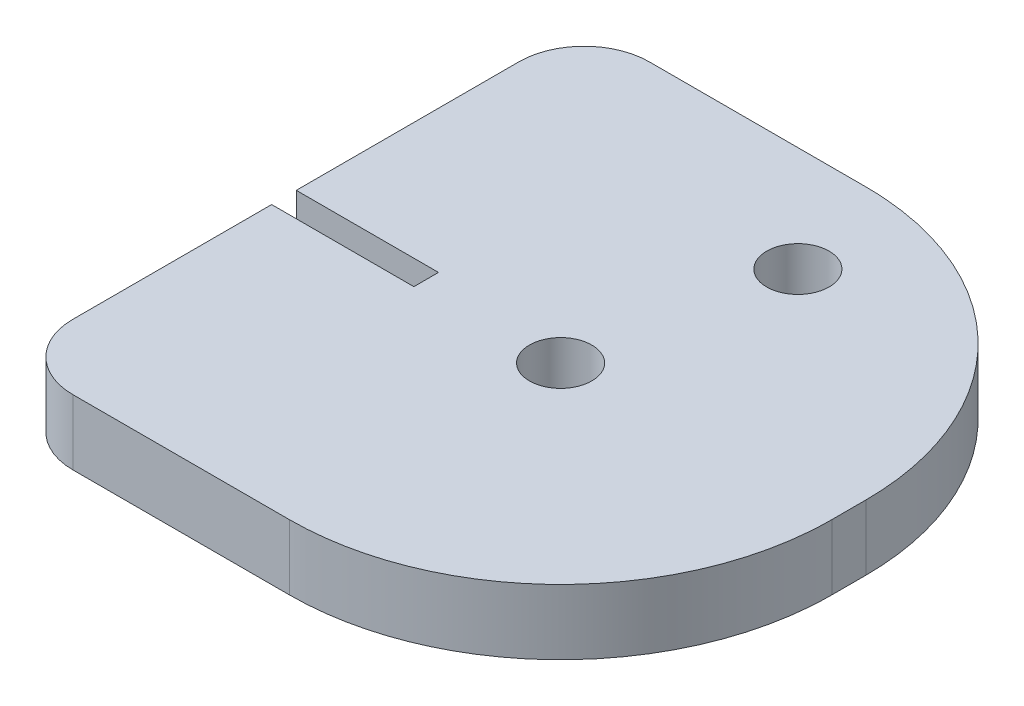
ISO-10303-21;
HEADER;
FILE_DESCRIPTION(('STEP AP214'),'2;1');
FILE_NAME('part.step','',(''),(''),'','','');
FILE_SCHEMA(('AUTOMOTIVE_DESIGN { 1 0 10303 214 1 1 1 1 }'));
ENDSEC;
DATA;
#1=APPLICATION_CONTEXT('core data for automotive mechanical design processes');
#2=APPLICATION_PROTOCOL_DEFINITION('international standard','automotive_design',2000,#1);
#3=PRODUCT_CONTEXT('',#1,'mechanical');
#4=PRODUCT('Part','Part','',(#3));
#5=PRODUCT_RELATED_PRODUCT_CATEGORY('part','',(#4));
#6=PRODUCT_DEFINITION_FORMATION('','',#4);
#7=PRODUCT_DEFINITION_CONTEXT('part definition',#1,'design');
#8=PRODUCT_DEFINITION('design','',#6,#7);
#9=PRODUCT_DEFINITION_SHAPE('','',#8);
#10=(LENGTH_UNIT() NAMED_UNIT(*) SI_UNIT(.MILLI.,.METRE.));
#11=(NAMED_UNIT(*) PLANE_ANGLE_UNIT() SI_UNIT($,.RADIAN.));
#12=(NAMED_UNIT(*) SI_UNIT($,.STERADIAN.) SOLID_ANGLE_UNIT());
#13=UNCERTAINTY_MEASURE_WITH_UNIT(LENGTH_MEASURE(1.E-05),#10,'distance_accuracy_value','');
#14=(GEOMETRIC_REPRESENTATION_CONTEXT(3) GLOBAL_UNCERTAINTY_ASSIGNED_CONTEXT((#13)) GLOBAL_UNIT_ASSIGNED_CONTEXT((#10,
#11,#12)) REPRESENTATION_CONTEXT('',''));
#15=CARTESIAN_POINT('',(0.,0.,0.));
#16=DIRECTION('',(0.,0.,1.));
#17=DIRECTION('',(1.,0.,0.));
#18=AXIS2_PLACEMENT_3D('',#15,#16,#17);
#19=CARTESIAN_POINT('',(6.13220271150249,0.,-14.0407050027723));
#20=DIRECTION('',(1.,0.,0.));
#21=DIRECTION('',(0.,0.,-1.));
#22=AXIS2_PLACEMENT_3D('',#19,#20,#21);
#23=PLANE('',#22);
#24=DIRECTION('',(0.,0.,-1.));
#25=VECTOR('',#24,1.);
#26=CARTESIAN_POINT('',(6.13220271150249,3.175,-14.0407050027723));
#27=LINE('',#26,#25);
#28=CARTESIAN_POINT('',(6.13220271150249,3.175,10.8512949972277));
#29=VERTEX_POINT('',#28);
#30=CARTESIAN_POINT('',(6.13220271150249,3.175,1.17177950580325));
#31=VERTEX_POINT('',#30);
#32=EDGE_CURVE('E178',#29,#31,#27,.T.);
#33=ORIENTED_EDGE('',*,*,#32,.T.);
#34=DIRECTION('',(0.,-1.,0.));
#35=VECTOR('',#34,1.);
#36=CARTESIAN_POINT('',(6.13220271150249,3.175,1.17177950580325));
#37=LINE('',#36,#35);
#38=CARTESIAN_POINT('',(6.13220271150249,0.,1.17177950580325));
#39=VERTEX_POINT('',#38);
#40=EDGE_CURVE('E168',#31,#39,#37,.T.);
#41=ORIENTED_EDGE('',*,*,#40,.T.);
#42=DIRECTION('',(0.,0.,-1.));
#43=VECTOR('',#42,1.);
#44=CARTESIAN_POINT('',(6.13220271150249,0.,-14.0407050027723));
#45=LINE('',#44,#43);
#46=CARTESIAN_POINT('',(6.13220271150249,0.,10.8512949972277));
#47=VERTEX_POINT('',#46);
#48=EDGE_CURVE('E173',#47,#39,#45,.T.);
#49=ORIENTED_EDGE('',*,*,#48,.F.);
#50=DIRECTION('',(0.,1.,0.));
#51=VECTOR('',#50,1.);
#52=CARTESIAN_POINT('',(6.13220271150249,0.,10.8512949972277));
#53=LINE('',#52,#51);
#54=EDGE_CURVE('E250',#47,#29,#53,.T.);
#55=ORIENTED_EDGE('',*,*,#54,.T.);
#56=EDGE_LOOP('',(#33,#41,#49,#55));
#57=FACE_BOUND('',#56,.T.);
#58=ADVANCED_FACE('F48',(#57),#23,.F.);
#59=CARTESIAN_POINT('',(-32.9837972884975,3.175,14.0262949972277));
#60=DIRECTION('',(0.,0.,-1.));
#61=DIRECTION('',(-1.,0.,0.));
#62=AXIS2_PLACEMENT_3D('',#59,#60,#61);
#63=PLANE('',#62);
#64=DIRECTION('',(1.,0.,0.));
#65=VECTOR('',#64,1.);
#66=CARTESIAN_POINT('',(-32.9837972884975,3.175,14.0262949972277));
#67=LINE('',#66,#65);
#68=CARTESIAN_POINT('',(9.3072027115025,3.175,14.0262949972277));
#69=VERTEX_POINT('',#68);
#70=CARTESIAN_POINT('',(19.8482027115025,3.175,14.0262949972277));
#71=VERTEX_POINT('',#70);
#72=EDGE_CURVE('E193',#69,#71,#67,.T.);
#73=ORIENTED_EDGE('',*,*,#72,.F.);
#74=DIRECTION('',(0.,1.,0.));
#75=VECTOR('',#74,1.);
#76=CARTESIAN_POINT('',(9.3072027115025,3.175,14.0262949972277));
#77=LINE('',#76,#75);
#78=CARTESIAN_POINT('',(9.3072027115025,0.,14.0262949972277));
#79=VERTEX_POINT('',#78);
#80=EDGE_CURVE('E257',#69,#79,#77,.F.);
#81=ORIENTED_EDGE('',*,*,#80,.T.);
#82=DIRECTION('',(1.,0.,0.));
#83=VECTOR('',#82,1.);
#84=CARTESIAN_POINT('',(-32.9837972884975,0.,14.0262949972277));
#85=LINE('',#84,#83);
#86=CARTESIAN_POINT('',(19.8482027115025,0.,14.0262949972277));
#87=VERTEX_POINT('',#86);
#88=EDGE_CURVE('E213',#79,#87,#85,.T.);
#89=ORIENTED_EDGE('',*,*,#88,.T.);
#90=DIRECTION('',(0.,-1.,0.));
#91=VECTOR('',#90,1.);
#92=CARTESIAN_POINT('',(19.8482027115025,3.175,14.0262949972277));
#93=LINE('',#92,#91);
#94=EDGE_CURVE('E191',#87,#71,#93,.F.);
#95=ORIENTED_EDGE('',*,*,#94,.T.);
#96=EDGE_LOOP('',(#73,#81,#89,#95));
#97=FACE_BOUND('',#96,.T.);
#98=ADVANCED_FACE('F272',(#97),#63,.F.);
#99=CARTESIAN_POINT('',(33.0562027115025,3.175,-14.0407050027723));
#100=DIRECTION('',(-1.,0.,0.));
#101=DIRECTION('',(0.,0.,1.));
#102=AXIS2_PLACEMENT_3D('',#99,#100,#101);
#103=PLANE('',#102);
#104=DIRECTION('',(0.,0.,-1.));
#105=VECTOR('',#104,1.);
#106=CARTESIAN_POINT('',(33.0562027115025,0.,-14.0407050027723));
#107=LINE('',#106,#105);
#108=CARTESIAN_POINT('',(33.0562027115025,0.,0.818294997227744));
#109=VERTEX_POINT('',#108);
#110=CARTESIAN_POINT('',(33.0562027115025,0.,-0.832705002772255));
#111=VERTEX_POINT('',#110);
#112=EDGE_CURVE('E218',#109,#111,#107,.T.);
#113=ORIENTED_EDGE('',*,*,#112,.T.);
#114=DIRECTION('',(0.,-1.,0.));
#115=VECTOR('',#114,1.);
#116=CARTESIAN_POINT('',(33.0562027115025,3.175,-0.832705002772255));
#117=LINE('',#116,#115);
#118=CARTESIAN_POINT('',(33.0562027115025,3.175,-0.832705002772255));
#119=VERTEX_POINT('',#118);
#120=EDGE_CURVE('E211',#111,#119,#117,.F.);
#121=ORIENTED_EDGE('',*,*,#120,.T.);
#122=DIRECTION('',(0.,0.,-1.));
#123=VECTOR('',#122,1.);
#124=CARTESIAN_POINT('',(33.0562027115025,3.175,-14.0407050027723));
#125=LINE('',#124,#123);
#126=CARTESIAN_POINT('',(33.0562027115025,3.175,0.818294997227744));
#127=VERTEX_POINT('',#126);
#128=EDGE_CURVE('E192',#127,#119,#125,.T.);
#129=ORIENTED_EDGE('',*,*,#128,.F.);
#130=DIRECTION('',(0.,-1.,0.));
#131=VECTOR('',#130,1.);
#132=CARTESIAN_POINT('',(33.0562027115025,3.175,0.818294997227744));
#133=LINE('',#132,#131);
#134=EDGE_CURVE('E200',#127,#109,#133,.T.);
#135=ORIENTED_EDGE('',*,*,#134,.T.);
#136=EDGE_LOOP('',(#113,#121,#129,#135));
#137=FACE_BOUND('',#136,.T.);
#138=ADVANCED_FACE('F281',(#137),#103,.F.);
#139=CARTESIAN_POINT('',(-32.9837972884975,3.175,-14.0407050027723));
#140=DIRECTION('',(0.,0.,1.));
#141=DIRECTION('',(1.,0.,0.));
#142=AXIS2_PLACEMENT_3D('',#139,#140,#141);
#143=PLANE('',#142);
#144=DIRECTION('',(-1.,0.,0.));
#145=VECTOR('',#144,1.);
#146=CARTESIAN_POINT('',(-32.9837972884975,0.,-14.0407050027723));
#147=LINE('',#146,#145);
#148=CARTESIAN_POINT('',(19.8482027115025,0.,-14.0407050027723));
#149=VERTEX_POINT('',#148);
#150=CARTESIAN_POINT('',(9.30720271150249,0.,-14.0407050027723));
#151=VERTEX_POINT('',#150);
#152=EDGE_CURVE('E195',#149,#151,#147,.T.);
#153=ORIENTED_EDGE('',*,*,#152,.T.);
#154=DIRECTION('',(0.,1.,0.));
#155=VECTOR('',#154,1.);
#156=CARTESIAN_POINT('',(9.30720271150249,3.175,-14.0407050027723));
#157=LINE('',#156,#155);
#158=CARTESIAN_POINT('',(9.30720271150249,3.175,-14.0407050027723));
#159=VERTEX_POINT('',#158);
#160=EDGE_CURVE('E13',#151,#159,#157,.T.);
#161=ORIENTED_EDGE('',*,*,#160,.T.);
#162=DIRECTION('',(-1.,0.,0.));
#163=VECTOR('',#162,1.);
#164=CARTESIAN_POINT('',(-32.9837972884975,3.175,-14.0407050027723));
#165=LINE('',#164,#163);
#166=CARTESIAN_POINT('',(19.8482027115025,3.175,-14.0407050027723));
#167=VERTEX_POINT('',#166);
#168=EDGE_CURVE('E188',#167,#159,#165,.T.);
#169=ORIENTED_EDGE('',*,*,#168,.F.);
#170=DIRECTION('',(0.,-1.,0.));
#171=VECTOR('',#170,1.);
#172=CARTESIAN_POINT('',(19.8482027115025,3.175,-14.0407050027723));
#173=LINE('',#172,#171);
#174=EDGE_CURVE('E212',#167,#149,#173,.T.);
#175=ORIENTED_EDGE('',*,*,#174,.T.);
#176=EDGE_LOOP('',(#153,#161,#169,#175));
#177=FACE_BOUND('',#176,.T.);
#178=ADVANCED_FACE('F289',(#177),#143,.F.);
#179=CARTESIAN_POINT('',(0.0362027115024786,3.175,-0.00720500277225217));
#180=DIRECTION('',(0.,1.,0.));
#181=DIRECTION('',(0.,0.,1.));
#182=AXIS2_PLACEMENT_3D('',#179,#180,#181);
#183=PLANE('',#182);
#184=DIRECTION('',(-1.,0.,0.));
#185=VECTOR('',#184,1.);
#186=CARTESIAN_POINT('',(6.13220271150249,3.175,1.17177950580325));
#187=LINE('',#186,#185);
#188=CARTESIAN_POINT('',(13.0573147119073,3.175,1.17177950580325));
#189=VERTEX_POINT('',#188);
#190=EDGE_CURVE('E153',#189,#31,#187,.T.);
#191=ORIENTED_EDGE('',*,*,#190,.T.);
#192=ORIENTED_EDGE('',*,*,#32,.F.);
#193=CARTESIAN_POINT('',(9.30720271150249,3.175,10.8512949972277));
#194=DIRECTION('',(0.,1.,0.));
#195=DIRECTION('',(0.,0.,1.));
#196=AXIS2_PLACEMENT_3D('',#193,#194,#195);
#197=CIRCLE('',#196,3.175);
#198=EDGE_CURVE('E255',#29,#69,#197,.T.);
#199=ORIENTED_EDGE('',*,*,#198,.T.);
#200=ORIENTED_EDGE('',*,*,#72,.T.);
#201=CARTESIAN_POINT('',(19.8482027115025,3.175,14.0262949972277));
#202=CARTESIAN_POINT('',(27.5852699796786,3.175,14.0262949972277));
#203=CARTESIAN_POINT('',(33.0562027115025,3.175,8.5553622654039));
#204=CARTESIAN_POINT('',(33.0562027115025,3.175,0.818294997227744));
#205=(BOUNDED_CURVE() B_SPLINE_CURVE(3,(#201,#202,#203,#204),.UNSPECIFIED.,.F.,
.F.) B_SPLINE_CURVE_WITH_KNOTS((4,4),(0.,1.),
.UNSPECIFIED.) CURVE() GEOMETRIC_REPRESENTATION_ITEM() RATIONAL_B_SPLINE_CURVE((1.,
0.804737854124365,0.804737854124365,1.)) REPRESENTATION_ITEM(''));
#206=EDGE_CURVE('E196',#71,#127,#205,.T.);
#207=ORIENTED_EDGE('',*,*,#206,.T.);
#208=ORIENTED_EDGE('',*,*,#128,.T.);
#209=CARTESIAN_POINT('',(33.0562027115025,3.175,-0.832705002772255));
#210=CARTESIAN_POINT('',(33.0562027115025,3.175,-8.56977227094841));
#211=CARTESIAN_POINT('',(27.5852699796786,3.175,-14.0407050027723));
#212=CARTESIAN_POINT('',(19.8482027115025,3.175,-14.0407050027723));
#213=(BOUNDED_CURVE() B_SPLINE_CURVE(3,(#209,#210,#211,#212),.UNSPECIFIED.,.F.,
.F.) B_SPLINE_CURVE_WITH_KNOTS((4,4),(0.,1.),
.UNSPECIFIED.) CURVE() GEOMETRIC_REPRESENTATION_ITEM() RATIONAL_B_SPLINE_CURVE((1.,
0.804737854124365,0.804737854124365,1.)) REPRESENTATION_ITEM(''));
#214=EDGE_CURVE('E207',#119,#167,#213,.T.);
#215=ORIENTED_EDGE('',*,*,#214,.T.);
#216=ORIENTED_EDGE('',*,*,#168,.T.);
#217=CARTESIAN_POINT('',(9.30720271150249,3.175,-10.8657050027723));
#218=DIRECTION('',(0.,1.,0.));
#219=DIRECTION('',(0.,0.,1.));
#220=AXIS2_PLACEMENT_3D('',#217,#218,#219);
#221=CIRCLE('',#220,3.175);
#222=CARTESIAN_POINT('',(6.13220271150249,3.175,-10.8657050027723));
#223=VERTEX_POINT('',#222);
#224=EDGE_CURVE('E253',#159,#223,#221,.T.);
#225=ORIENTED_EDGE('',*,*,#224,.T.);
#226=CARTESIAN_POINT('',(6.13220271150249,3.175,-0.0282204941967502));
#227=VERTEX_POINT('',#226);
#228=EDGE_CURVE('E159',#227,#223,#27,.T.);
#229=ORIENTED_EDGE('',*,*,#228,.F.);
#230=DIRECTION('',(1.,0.,0.));
#231=VECTOR('',#230,1.);
#232=CARTESIAN_POINT('',(6.13220271150249,3.175,-0.0282204941967497));
#233=LINE('',#232,#231);
#234=CARTESIAN_POINT('',(13.0573147119073,3.175,-0.0282204941967497));
#235=VERTEX_POINT('',#234);
#236=EDGE_CURVE('E63',#227,#235,#233,.T.);
#237=ORIENTED_EDGE('',*,*,#236,.T.);
#238=DIRECTION('',(0.,0.,1.));
#239=VECTOR('',#238,1.);
#240=CARTESIAN_POINT('',(13.0573147119073,3.175,1.17177950580325));
#241=LINE('',#240,#239);
#242=EDGE_CURVE('E148',#235,#189,#241,.T.);
#243=ORIENTED_EDGE('',*,*,#242,.T.);
#244=EDGE_LOOP('',(#191,#192,#199,#200,#207,#208,#215,#216,#225,#229,#237,#243));
#245=FACE_BOUND('',#244,.T.);
#246=CARTESIAN_POINT('',(21.6643027115025,3.175,-8.91980629563217));
#247=DIRECTION('',(0.,1.,0.));
#248=DIRECTION('',(0.,0.,1.));
#249=AXIS2_PLACEMENT_3D('',#246,#247,#248);
#250=CIRCLE('',#249,1.517269);
#251=CARTESIAN_POINT('',(21.6643027115025,3.175,-7.40253729563217));
#252=VERTEX_POINT('',#251);
#253=EDGE_CURVE('E176',#252,#252,#250,.T.);
#254=ORIENTED_EDGE('',*,*,#253,.F.);
#255=EDGE_LOOP('',(#254));
#256=FACE_BOUND('',#255,.T.);
#257=CARTESIAN_POINT('',(19.8482027115025,3.175,0.818294997227746));
#258=DIRECTION('',(0.,1.,0.));
#259=DIRECTION('',(0.,0.,1.));
#260=AXIS2_PLACEMENT_3D('',#257,#258,#259);
#261=CIRCLE('',#260,1.517269);
#262=CARTESIAN_POINT('',(19.8482027115025,3.175,2.33556399722775));
#263=VERTEX_POINT('',#262);
#264=EDGE_CURVE('E184',#263,#263,#261,.T.);
#265=ORIENTED_EDGE('',*,*,#264,.F.);
#266=EDGE_LOOP('',(#265));
#267=FACE_BOUND('',#266,.T.);
#268=ADVANCED_FACE('F156',(#245,#256,#267),#183,.T.);
#269=CARTESIAN_POINT('',(0.0362027115024786,0.,-0.00720500277225217));
#270=DIRECTION('',(0.,1.,0.));
#271=DIRECTION('',(0.,0.,1.));
#272=AXIS2_PLACEMENT_3D('',#269,#270,#271);
#273=PLANE('',#272);
#274=CARTESIAN_POINT('',(21.6643027115025,0.,-8.91980629563217));
#275=DIRECTION('',(0.,1.,0.));
#276=DIRECTION('',(0.,0.,1.));
#277=AXIS2_PLACEMENT_3D('',#274,#275,#276);
#278=CIRCLE('',#277,1.517269);
#279=CARTESIAN_POINT('',(21.6643027115025,0.,-7.40253729563217));
#280=VERTEX_POINT('',#279);
#281=EDGE_CURVE('E183',#280,#280,#278,.T.);
#282=ORIENTED_EDGE('',*,*,#281,.T.);
#283=EDGE_LOOP('',(#282));
#284=FACE_BOUND('',#283,.T.);
#285=CARTESIAN_POINT('',(19.8482027115025,0.,0.818294997227746));
#286=DIRECTION('',(0.,1.,0.));
#287=DIRECTION('',(0.,0.,1.));
#288=AXIS2_PLACEMENT_3D('',#285,#286,#287);
#289=CIRCLE('',#288,1.517269);
#290=CARTESIAN_POINT('',(19.8482027115025,0.,2.33556399722775));
#291=VERTEX_POINT('',#290);
#292=EDGE_CURVE('E187',#291,#291,#289,.T.);
#293=ORIENTED_EDGE('',*,*,#292,.T.);
#294=EDGE_LOOP('',(#293));
#295=FACE_BOUND('',#294,.T.);
#296=ORIENTED_EDGE('',*,*,#48,.T.);
#297=DIRECTION('',(-1.,0.,0.));
#298=VECTOR('',#297,1.);
#299=CARTESIAN_POINT('',(6.13220271150249,0.,1.17177950580325));
#300=LINE('',#299,#298);
#301=CARTESIAN_POINT('',(13.0573147119073,0.,1.17177950580325));
#302=VERTEX_POINT('',#301);
#303=EDGE_CURVE('E160',#302,#39,#300,.T.);
#304=ORIENTED_EDGE('',*,*,#303,.F.);
#305=DIRECTION('',(0.,0.,1.));
#306=VECTOR('',#305,1.);
#307=CARTESIAN_POINT('',(13.0573147119073,0.,1.17177950580325));
#308=LINE('',#307,#306);
#309=CARTESIAN_POINT('',(13.0573147119073,0.,-0.0282204941967497));
#310=VERTEX_POINT('',#309);
#311=EDGE_CURVE('E162',#310,#302,#308,.T.);
#312=ORIENTED_EDGE('',*,*,#311,.F.);
#313=DIRECTION('',(1.,0.,0.));
#314=VECTOR('',#313,1.);
#315=CARTESIAN_POINT('',(6.13220271150249,0.,-0.0282204941967497));
#316=LINE('',#315,#314);
#317=CARTESIAN_POINT('',(6.13220271150249,0.,-0.0282204941967497));
#318=VERTEX_POINT('',#317);
#319=EDGE_CURVE('E140',#318,#310,#316,.T.);
#320=ORIENTED_EDGE('',*,*,#319,.F.);
#321=CARTESIAN_POINT('',(6.13220271150249,0.,-10.8657050027723));
#322=VERTEX_POINT('',#321);
#323=EDGE_CURVE('E177',#318,#322,#45,.T.);
#324=ORIENTED_EDGE('',*,*,#323,.T.);
#325=CARTESIAN_POINT('',(9.30720271150249,0.,-10.8657050027723));
#326=DIRECTION('',(0.,1.,0.));
#327=DIRECTION('',(0.,0.,1.));
#328=AXIS2_PLACEMENT_3D('',#325,#326,#327);
#329=CIRCLE('',#328,3.175);
#330=EDGE_CURVE('E71',#322,#151,#329,.F.);
#331=ORIENTED_EDGE('',*,*,#330,.T.);
#332=ORIENTED_EDGE('',*,*,#152,.F.);
#333=CARTESIAN_POINT('',(33.0562027115025,0.,-0.832705002772255));
#334=CARTESIAN_POINT('',(33.0562027115025,0.,-8.56977227094841));
#335=CARTESIAN_POINT('',(27.5852699796786,0.,-14.0407050027723));
#336=CARTESIAN_POINT('',(19.8482027115025,0.,-14.0407050027723));
#337=(BOUNDED_CURVE() B_SPLINE_CURVE(3,(#333,#334,#335,#336),.UNSPECIFIED.,.F.,
.F.) B_SPLINE_CURVE_WITH_KNOTS((4,4),(0.,1.),
.UNSPECIFIED.) CURVE() GEOMETRIC_REPRESENTATION_ITEM() RATIONAL_B_SPLINE_CURVE((1.,
0.804737854124365,0.804737854124365,1.)) REPRESENTATION_ITEM(''));
#338=EDGE_CURVE('E226',#149,#111,#337,.F.);
#339=ORIENTED_EDGE('',*,*,#338,.T.);
#340=ORIENTED_EDGE('',*,*,#112,.F.);
#341=CARTESIAN_POINT('',(19.8482027115025,0.,14.0262949972277));
#342=CARTESIAN_POINT('',(27.5852699796786,0.,14.0262949972277));
#343=CARTESIAN_POINT('',(33.0562027115025,0.,8.5553622654039));
#344=CARTESIAN_POINT('',(33.0562027115025,0.,0.818294997227744));
#345=(BOUNDED_CURVE() B_SPLINE_CURVE(3,(#341,#342,#343,#344),.UNSPECIFIED.,.F.,
.F.) B_SPLINE_CURVE_WITH_KNOTS((4,4),(0.,1.),
.UNSPECIFIED.) CURVE() GEOMETRIC_REPRESENTATION_ITEM() RATIONAL_B_SPLINE_CURVE((1.,
0.804737854124365,0.804737854124365,1.)) REPRESENTATION_ITEM(''));
#346=EDGE_CURVE('E201',#109,#87,#345,.F.);
#347=ORIENTED_EDGE('',*,*,#346,.T.);
#348=ORIENTED_EDGE('',*,*,#88,.F.);
#349=CARTESIAN_POINT('',(9.30720271150249,0.,10.8512949972277));
#350=DIRECTION('',(0.,1.,0.));
#351=DIRECTION('',(0.,0.,1.));
#352=AXIS2_PLACEMENT_3D('',#349,#350,#351);
#353=CIRCLE('',#352,3.175);
#354=EDGE_CURVE('E56',#79,#47,#353,.F.);
#355=ORIENTED_EDGE('',*,*,#354,.T.);
#356=EDGE_LOOP('',(#296,#304,#312,#320,#324,#331,#332,#339,#340,#347,#348,#355));
#357=FACE_BOUND('',#356,.T.);
#358=ADVANCED_FACE('F262',(#284,#295,#357),#273,.F.);
#359=CARTESIAN_POINT('',(19.8482027115025,3.175,0.818294997227745));
#360=DIRECTION('',(0.,-1.,0.));
#361=DIRECTION('',(0.,0.,-1.));
#362=AXIS2_PLACEMENT_3D('',#359,#360,#361);
#363=CYLINDRICAL_SURFACE('',#362,13.208);
#364=ORIENTED_EDGE('',*,*,#206,.F.);
#365=ORIENTED_EDGE('',*,*,#94,.F.);
#366=ORIENTED_EDGE('',*,*,#346,.F.);
#367=ORIENTED_EDGE('',*,*,#134,.F.);
#368=EDGE_LOOP('',(#364,#365,#366,#367));
#369=FACE_BOUND('',#368,.T.);
#370=ADVANCED_FACE('F277',(#369),#363,.T.);
#371=CARTESIAN_POINT('',(19.8482027115025,0.,0.818294997227746));
#372=DIRECTION('',(0.,1.,0.));
#373=DIRECTION('',(0.,0.,1.));
#374=AXIS2_PLACEMENT_3D('',#371,#372,#373);
#375=CYLINDRICAL_SURFACE('',#374,1.517269);
#376=ORIENTED_EDGE('',*,*,#292,.F.);
#377=EDGE_LOOP('',(#376));
#378=FACE_BOUND('',#377,.T.);
#379=ORIENTED_EDGE('',*,*,#264,.T.);
#380=EDGE_LOOP('',(#379));
#381=FACE_BOUND('',#380,.T.);
#382=ADVANCED_FACE('F322',(#378,#381),#375,.F.);
#383=CARTESIAN_POINT('',(21.6643027115025,0.,-8.91980629563217));
#384=DIRECTION('',(0.,1.,0.));
#385=DIRECTION('',(0.,0.,1.));
#386=AXIS2_PLACEMENT_3D('',#383,#384,#385);
#387=CYLINDRICAL_SURFACE('',#386,1.517269);
#388=ORIENTED_EDGE('',*,*,#281,.F.);
#389=EDGE_LOOP('',(#388));
#390=FACE_BOUND('',#389,.T.);
#391=ORIENTED_EDGE('',*,*,#253,.T.);
#392=EDGE_LOOP('',(#391));
#393=FACE_BOUND('',#392,.T.);
#394=ADVANCED_FACE('F317',(#390,#393),#387,.F.);
#395=CARTESIAN_POINT('',(19.8482027115025,3.175,-0.832705002772252));
#396=DIRECTION('',(0.,-1.,0.));
#397=DIRECTION('',(0.,0.,-1.));
#398=AXIS2_PLACEMENT_3D('',#395,#396,#397);
#399=CYLINDRICAL_SURFACE('',#398,13.208);
#400=ORIENTED_EDGE('',*,*,#214,.F.);
#401=ORIENTED_EDGE('',*,*,#120,.F.);
#402=ORIENTED_EDGE('',*,*,#338,.F.);
#403=ORIENTED_EDGE('',*,*,#174,.F.);
#404=EDGE_LOOP('',(#400,#401,#402,#403));
#405=FACE_BOUND('',#404,.T.);
#406=ADVANCED_FACE('F285',(#405),#399,.T.);
#407=ORIENTED_EDGE('',*,*,#323,.F.);
#408=DIRECTION('',(0.,-1.,0.));
#409=VECTOR('',#408,1.);
#410=CARTESIAN_POINT('',(6.13220271150249,3.175,-0.0282204941967497));
#411=LINE('',#410,#409);
#412=EDGE_CURVE('E145',#227,#318,#411,.T.);
#413=ORIENTED_EDGE('',*,*,#412,.F.);
#414=ORIENTED_EDGE('',*,*,#228,.T.);
#415=DIRECTION('',(0.,1.,0.));
#416=VECTOR('',#415,1.);
#417=CARTESIAN_POINT('',(6.13220271150249,0.,-10.8657050027723));
#418=LINE('',#417,#416);
#419=EDGE_CURVE('E243',#223,#322,#418,.F.);
#420=ORIENTED_EDGE('',*,*,#419,.T.);
#421=EDGE_LOOP('',(#407,#413,#414,#420));
#422=FACE_BOUND('',#421,.T.);
#423=ADVANCED_FACE('F295',(#422),#23,.F.);
#424=CARTESIAN_POINT('',(9.30720271150249,0.,10.8512949972277));
#425=DIRECTION('',(0.,1.,0.));
#426=DIRECTION('',(0.,0.,1.));
#427=AXIS2_PLACEMENT_3D('',#424,#425,#426);
#428=CYLINDRICAL_SURFACE('',#427,3.175);
#429=ORIENTED_EDGE('',*,*,#354,.F.);
#430=ORIENTED_EDGE('',*,*,#80,.F.);
#431=ORIENTED_EDGE('',*,*,#198,.F.);
#432=ORIENTED_EDGE('',*,*,#54,.F.);
#433=EDGE_LOOP('',(#429,#430,#431,#432));
#434=FACE_BOUND('',#433,.T.);
#435=ADVANCED_FACE('F269',(#434),#428,.T.);
#436=CARTESIAN_POINT('',(9.30720271150249,3.175,-10.8657050027723));
#437=DIRECTION('',(0.,1.,0.));
#438=DIRECTION('',(0.,0.,1.));
#439=AXIS2_PLACEMENT_3D('',#436,#437,#438);
#440=CYLINDRICAL_SURFACE('',#439,3.175);
#441=ORIENTED_EDGE('',*,*,#330,.F.);
#442=ORIENTED_EDGE('',*,*,#419,.F.);
#443=ORIENTED_EDGE('',*,*,#224,.F.);
#444=ORIENTED_EDGE('',*,*,#160,.F.);
#445=EDGE_LOOP('',(#441,#442,#443,#444));
#446=FACE_BOUND('',#445,.T.);
#447=ADVANCED_FACE('F50',(#446),#440,.T.);
#448=CARTESIAN_POINT('',(6.13220271150249,3.175,1.17177950580325));
#449=DIRECTION('',(0.,0.,1.));
#450=DIRECTION('',(1.,0.,0.));
#451=AXIS2_PLACEMENT_3D('',#448,#449,#450);
#452=PLANE('',#451);
#453=ORIENTED_EDGE('',*,*,#303,.T.);
#454=ORIENTED_EDGE('',*,*,#40,.F.);
#455=ORIENTED_EDGE('',*,*,#190,.F.);
#456=DIRECTION('',(0.,-1.,0.));
#457=VECTOR('',#456,1.);
#458=CARTESIAN_POINT('',(13.0573147119073,3.175,1.17177950580325));
#459=LINE('',#458,#457);
#460=EDGE_CURVE('E144',#189,#302,#459,.T.);
#461=ORIENTED_EDGE('',*,*,#460,.T.);
#462=EDGE_LOOP('',(#453,#454,#455,#461));
#463=FACE_BOUND('',#462,.T.);
#464=ADVANCED_FACE('F297',(#463),#452,.F.);
#465=CARTESIAN_POINT('',(13.0573147119073,3.175,1.17177950580325));
#466=DIRECTION('',(1.,0.,0.));
#467=DIRECTION('',(0.,0.,-1.));
#468=AXIS2_PLACEMENT_3D('',#465,#466,#467);
#469=PLANE('',#468);
#470=ORIENTED_EDGE('',*,*,#311,.T.);
#471=ORIENTED_EDGE('',*,*,#460,.F.);
#472=ORIENTED_EDGE('',*,*,#242,.F.);
#473=DIRECTION('',(0.,-1.,0.));
#474=VECTOR('',#473,1.);
#475=CARTESIAN_POINT('',(13.0573147119073,3.175,-0.0282204941967497));
#476=LINE('',#475,#474);
#477=EDGE_CURVE('E136',#235,#310,#476,.T.);
#478=ORIENTED_EDGE('',*,*,#477,.T.);
#479=EDGE_LOOP('',(#470,#471,#472,#478));
#480=FACE_BOUND('',#479,.T.);
#481=ADVANCED_FACE('F149',(#480),#469,.F.);
#482=CARTESIAN_POINT('',(6.13220271150249,3.175,-0.0282204941967497));
#483=DIRECTION('',(0.,0.,-1.));
#484=DIRECTION('',(-1.,0.,0.));
#485=AXIS2_PLACEMENT_3D('',#482,#483,#484);
#486=PLANE('',#485);
#487=ORIENTED_EDGE('',*,*,#319,.T.);
#488=ORIENTED_EDGE('',*,*,#477,.F.);
#489=ORIENTED_EDGE('',*,*,#236,.F.);
#490=ORIENTED_EDGE('',*,*,#412,.T.);
#491=EDGE_LOOP('',(#487,#488,#489,#490));
#492=FACE_BOUND('',#491,.T.);
#493=ADVANCED_FACE('F138',(#492),#486,.F.);
#494=CLOSED_SHELL('',(#58,#98,#138,#178,#268,#358,#370,#382,#394,#406,#423,#435,#447,#464,#481,#493));
#495=MANIFOLD_SOLID_BREP('B2',#494);
#496=ADVANCED_BREP_SHAPE_REPRESENTATION('',(#18,#495),#14);
#497=SHAPE_DEFINITION_REPRESENTATION(#9,#496);
ENDSEC;
END-ISO-10303-21;
